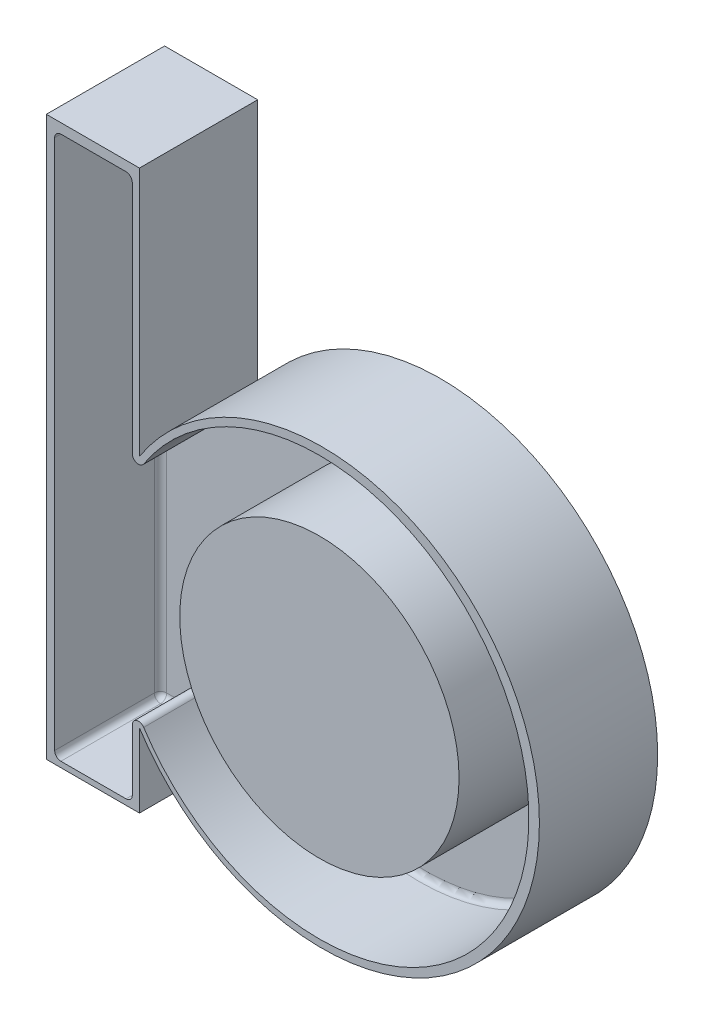
ISO-10303-21;
HEADER;
FILE_DESCRIPTION(('STEP AP214'),'2;1');
FILE_NAME('part.step','',(''),(''),'','','');
FILE_SCHEMA(('AUTOMOTIVE_DESIGN { 1 0 10303 214 1 1 1 1 }'));
ENDSEC;
DATA;
#1=APPLICATION_CONTEXT('core data for automotive mechanical design processes');
#2=APPLICATION_PROTOCOL_DEFINITION('international standard','automotive_design',2000,#1);
#3=PRODUCT_CONTEXT('',#1,'mechanical');
#4=PRODUCT('Part','Part','',(#3));
#5=PRODUCT_RELATED_PRODUCT_CATEGORY('part','',(#4));
#6=PRODUCT_DEFINITION_FORMATION('','',#4);
#7=PRODUCT_DEFINITION_CONTEXT('part definition',#1,'design');
#8=PRODUCT_DEFINITION('design','',#6,#7);
#9=PRODUCT_DEFINITION_SHAPE('','',#8);
#10=(LENGTH_UNIT() NAMED_UNIT(*) SI_UNIT(.MILLI.,.METRE.));
#11=(NAMED_UNIT(*) PLANE_ANGLE_UNIT() SI_UNIT($,.RADIAN.));
#12=(NAMED_UNIT(*) SI_UNIT($,.STERADIAN.) SOLID_ANGLE_UNIT());
#13=UNCERTAINTY_MEASURE_WITH_UNIT(LENGTH_MEASURE(1.E-05),#10,'distance_accuracy_value','');
#14=(GEOMETRIC_REPRESENTATION_CONTEXT(3) GLOBAL_UNCERTAINTY_ASSIGNED_CONTEXT((#13)) GLOBAL_UNIT_ASSIGNED_CONTEXT((#10,
#11,#12)) REPRESENTATION_CONTEXT('',''));
#15=CARTESIAN_POINT('',(0.,0.,0.));
#16=DIRECTION('',(0.,0.,1.));
#17=DIRECTION('',(1.,0.,0.));
#18=AXIS2_PLACEMENT_3D('',#15,#16,#17);
#19=CARTESIAN_POINT('',(29.6419050127039,18.0091974915424,19.05));
#20=DIRECTION('',(-1.,0.,0.));
#21=DIRECTION('',(0.,-1.,0.));
#22=AXIS2_PLACEMENT_3D('',#19,#20,#21);
#23=PLANE('',#22);
#24=DIRECTION('',(0.,1.,0.));
#25=VECTOR('',#24,1.);
#26=CARTESIAN_POINT('',(29.6419050127039,18.0091974915424,0.));
#27=LINE('',#26,#25);
#28=CARTESIAN_POINT('',(29.6419050127039,6.11678388725156,0.));
#29=VERTEX_POINT('',#28);
#30=CARTESIAN_POINT('',(29.6419050127036,18.0091974915423,0.));
#31=VERTEX_POINT('',#30);
#32=EDGE_CURVE('E212',#29,#31,#27,.T.);
#33=ORIENTED_EDGE('',*,*,#32,.T.);
#34=DIRECTION('',(0.,0.,-1.));
#35=VECTOR('',#34,1.);
#36=CARTESIAN_POINT('',(29.6419050127036,18.0091974915423,19.05));
#37=LINE('',#36,#35);
#38=CARTESIAN_POINT('',(29.6419050127036,18.0091974915423,19.05));
#39=VERTEX_POINT('',#38);
#40=EDGE_CURVE('E191',#39,#31,#37,.T.);
#41=ORIENTED_EDGE('',*,*,#40,.F.);
#42=DIRECTION('',(0.,1.,0.));
#43=VECTOR('',#42,1.);
#44=CARTESIAN_POINT('',(29.6419050127039,18.0091974915424,19.05));
#45=LINE('',#44,#43);
#46=CARTESIAN_POINT('',(29.6419050127039,6.11678388725156,19.05));
#47=VERTEX_POINT('',#46);
#48=EDGE_CURVE('E199',#47,#39,#45,.T.);
#49=ORIENTED_EDGE('',*,*,#48,.F.);
#50=DIRECTION('',(0.,0.,-1.));
#51=VECTOR('',#50,1.);
#52=CARTESIAN_POINT('',(29.6419050127039,6.11678388725156,19.05));
#53=LINE('',#52,#51);
#54=EDGE_CURVE('E412',#47,#29,#53,.T.);
#55=ORIENTED_EDGE('',*,*,#54,.T.);
#56=EDGE_LOOP('',(#33,#41,#49,#55));
#57=FACE_BOUND('',#56,.T.);
#58=ADVANCED_FACE('F43',(#57),#23,.F.);
#59=CARTESIAN_POINT('',(59.0779546085231,36.9437950365785,19.05));
#60=DIRECTION('',(0.,0.,-1.));
#61=DIRECTION('',(-1.,0.,0.));
#62=AXIS2_PLACEMENT_3D('',#59,#60,#61);
#63=CYLINDRICAL_SURFACE('',#62,35.0000000000006);
#64=CARTESIAN_POINT('',(59.0779546085231,36.9437950365785,0.));
#65=DIRECTION('',(0.,0.,1.));
#66=DIRECTION('',(1.,0.,0.));
#67=AXIS2_PLACEMENT_3D('',#64,#65,#66);
#68=CIRCLE('',#67,35.0000000000006);
#69=CARTESIAN_POINT('',(29.6419050127039,55.8783925816158,0.));
#70=VERTEX_POINT('',#69);
#71=EDGE_CURVE('E415',#31,#70,#68,.T.);
#72=ORIENTED_EDGE('',*,*,#71,.T.);
#73=DIRECTION('',(0.,0.,-1.));
#74=VECTOR('',#73,1.);
#75=CARTESIAN_POINT('',(29.6419050127039,55.8783925816158,19.05));
#76=LINE('',#75,#74);
#77=CARTESIAN_POINT('',(29.6419050127039,55.8783925816158,19.05));
#78=VERTEX_POINT('',#77);
#79=EDGE_CURVE('E194',#78,#70,#76,.T.);
#80=ORIENTED_EDGE('',*,*,#79,.F.);
#81=CARTESIAN_POINT('',(59.0779546085231,36.9437950365785,19.05));
#82=DIRECTION('',(0.,0.,1.));
#83=DIRECTION('',(1.,0.,0.));
#84=AXIS2_PLACEMENT_3D('',#81,#82,#83);
#85=CIRCLE('',#84,35.0000000000006);
#86=EDGE_CURVE('E187',#39,#78,#85,.T.);
#87=ORIENTED_EDGE('',*,*,#86,.F.);
#88=ORIENTED_EDGE('',*,*,#40,.T.);
#89=EDGE_LOOP('',(#72,#80,#87,#88));
#90=FACE_BOUND('',#89,.T.);
#91=ADVANCED_FACE('F189',(#90),#63,.T.);
#92=CARTESIAN_POINT('',(29.6419050127039,96.1167838872516,19.05));
#93=DIRECTION('',(-1.,0.,0.));
#94=DIRECTION('',(0.,-1.,0.));
#95=AXIS2_PLACEMENT_3D('',#92,#93,#94);
#96=PLANE('',#95);
#97=DIRECTION('',(0.,1.,0.));
#98=VECTOR('',#97,1.);
#99=CARTESIAN_POINT('',(29.6419050127039,96.1167838872516,0.));
#100=LINE('',#99,#98);
#101=CARTESIAN_POINT('',(29.6419050127039,96.1167838872516,0.));
#102=VERTEX_POINT('',#101);
#103=EDGE_CURVE('E418',#70,#102,#100,.T.);
#104=ORIENTED_EDGE('',*,*,#103,.T.);
#105=DIRECTION('',(0.,0.,-1.));
#106=VECTOR('',#105,1.);
#107=CARTESIAN_POINT('',(29.6419050127039,96.1167838872516,19.05));
#108=LINE('',#107,#106);
#109=CARTESIAN_POINT('',(29.6419050127039,96.1167838872516,19.05));
#110=VERTEX_POINT('',#109);
#111=EDGE_CURVE('E220',#110,#102,#108,.T.);
#112=ORIENTED_EDGE('',*,*,#111,.F.);
#113=DIRECTION('',(0.,1.,0.));
#114=VECTOR('',#113,1.);
#115=CARTESIAN_POINT('',(29.6419050127039,96.1167838872516,19.05));
#116=LINE('',#115,#114);
#117=EDGE_CURVE('E198',#78,#110,#116,.T.);
#118=ORIENTED_EDGE('',*,*,#117,.F.);
#119=ORIENTED_EDGE('',*,*,#79,.T.);
#120=EDGE_LOOP('',(#104,#112,#118,#119));
#121=FACE_BOUND('',#120,.T.);
#122=ADVANCED_FACE('F458',(#121),#96,.F.);
#123=CARTESIAN_POINT('',(14.6419050127039,96.1167838872516,19.05));
#124=DIRECTION('',(0.,-1.,0.));
#125=DIRECTION('',(0.,0.,-1.));
#126=AXIS2_PLACEMENT_3D('',#123,#124,#125);
#127=PLANE('',#126);
#128=DIRECTION('',(-1.,0.,0.));
#129=VECTOR('',#128,1.);
#130=CARTESIAN_POINT('',(14.6419050127039,96.1167838872516,0.));
#131=LINE('',#130,#129);
#132=CARTESIAN_POINT('',(14.6419050127039,96.1167838872516,0.));
#133=VERTEX_POINT('',#132);
#134=EDGE_CURVE('E421',#102,#133,#131,.T.);
#135=ORIENTED_EDGE('',*,*,#134,.T.);
#136=DIRECTION('',(0.,0.,-1.));
#137=VECTOR('',#136,1.);
#138=CARTESIAN_POINT('',(14.6419050127039,96.1167838872516,19.05));
#139=LINE('',#138,#137);
#140=CARTESIAN_POINT('',(14.6419050127039,96.1167838872516,19.05));
#141=VERTEX_POINT('',#140);
#142=EDGE_CURVE('E435',#141,#133,#139,.T.);
#143=ORIENTED_EDGE('',*,*,#142,.F.);
#144=DIRECTION('',(-1.,0.,0.));
#145=VECTOR('',#144,1.);
#146=CARTESIAN_POINT('',(14.6419050127039,96.1167838872516,19.05));
#147=LINE('',#146,#145);
#148=EDGE_CURVE('E404',#110,#141,#147,.T.);
#149=ORIENTED_EDGE('',*,*,#148,.F.);
#150=ORIENTED_EDGE('',*,*,#111,.T.);
#151=EDGE_LOOP('',(#135,#143,#149,#150));
#152=FACE_BOUND('',#151,.T.);
#153=ADVANCED_FACE('F444',(#152),#127,.F.);
#154=CARTESIAN_POINT('',(14.6419050127039,96.1167838872516,19.05));
#155=DIRECTION('',(1.,0.,0.));
#156=DIRECTION('',(0.,0.,-1.));
#157=AXIS2_PLACEMENT_3D('',#154,#155,#156);
#158=PLANE('',#157);
#159=DIRECTION('',(0.,-1.,0.));
#160=VECTOR('',#159,1.);
#161=CARTESIAN_POINT('',(14.6419050127039,96.1167838872516,0.));
#162=LINE('',#161,#160);
#163=CARTESIAN_POINT('',(14.6419050127039,6.11678388725156,0.));
#164=VERTEX_POINT('',#163);
#165=EDGE_CURVE('E424',#133,#164,#162,.T.);
#166=ORIENTED_EDGE('',*,*,#165,.T.);
#167=DIRECTION('',(0.,0.,-1.));
#168=VECTOR('',#167,1.);
#169=CARTESIAN_POINT('',(14.6419050127039,6.11678388725156,19.05));
#170=LINE('',#169,#168);
#171=CARTESIAN_POINT('',(14.6419050127039,6.11678388725156,19.05));
#172=VERTEX_POINT('',#171);
#173=EDGE_CURVE('E431',#172,#164,#170,.T.);
#174=ORIENTED_EDGE('',*,*,#173,.F.);
#175=DIRECTION('',(0.,-1.,0.));
#176=VECTOR('',#175,1.);
#177=CARTESIAN_POINT('',(14.6419050127039,96.1167838872516,19.05));
#178=LINE('',#177,#176);
#179=EDGE_CURVE('E407',#141,#172,#178,.T.);
#180=ORIENTED_EDGE('',*,*,#179,.F.);
#181=ORIENTED_EDGE('',*,*,#142,.T.);
#182=EDGE_LOOP('',(#166,#174,#180,#181));
#183=FACE_BOUND('',#182,.T.);
#184=ADVANCED_FACE('F454',(#183),#158,.F.);
#185=CARTESIAN_POINT('',(14.6419050127039,6.11678388725156,19.05));
#186=DIRECTION('',(0.,1.,0.));
#187=DIRECTION('',(0.,0.,1.));
#188=AXIS2_PLACEMENT_3D('',#185,#186,#187);
#189=PLANE('',#188);
#190=DIRECTION('',(1.,0.,0.));
#191=VECTOR('',#190,1.);
#192=CARTESIAN_POINT('',(14.6419050127039,6.11678388725156,0.));
#193=LINE('',#192,#191);
#194=EDGE_CURVE('E209',#164,#29,#193,.T.);
#195=ORIENTED_EDGE('',*,*,#194,.T.);
#196=ORIENTED_EDGE('',*,*,#54,.F.);
#197=DIRECTION('',(1.,0.,0.));
#198=VECTOR('',#197,1.);
#199=CARTESIAN_POINT('',(14.6419050127039,6.11678388725156,19.05));
#200=LINE('',#199,#198);
#201=EDGE_CURVE('E204',#172,#47,#200,.T.);
#202=ORIENTED_EDGE('',*,*,#201,.F.);
#203=ORIENTED_EDGE('',*,*,#173,.T.);
#204=EDGE_LOOP('',(#195,#196,#202,#203));
#205=FACE_BOUND('',#204,.T.);
#206=ADVANCED_FACE('F457',(#205),#189,.F.);
#207=CARTESIAN_POINT('',(59.0779546085231,36.9437950365785,19.05));
#208=DIRECTION('',(0.,0.,1.));
#209=DIRECTION('',(1.,0.,0.));
#210=AXIS2_PLACEMENT_3D('',#207,#208,#209);
#211=PLANE('',#210);
#212=CARTESIAN_POINT('',(58.6339937658264,36.7909244992604,19.05));
#213=DIRECTION('',(0.,0.,1.));
#214=DIRECTION('',(1.,0.,0.));
#215=AXIS2_PLACEMENT_3D('',#212,#213,#214);
#216=CIRCLE('',#215,33.75);
#217=CARTESIAN_POINT('',(30.3251131955791,18.4151311596663,19.05));
#218=VERTEX_POINT('',#217);
#219=CARTESIAN_POINT('',(30.3251131955791,55.1667178388545,19.05));
#220=VERTEX_POINT('',#219);
#221=EDGE_CURVE('E387',#218,#220,#216,.T.);
#222=ORIENTED_EDGE('',*,*,#221,.F.);
#223=CARTESIAN_POINT('',(29.4863315490532,17.8706632088635,19.05));
#224=DIRECTION('',(0.,0.,1.));
#225=DIRECTION('',(1.,0.,0.));
#226=AXIS2_PLACEMENT_3D('',#223,#224,#225);
#227=CIRCLE('',#226,1.);
#228=CARTESIAN_POINT('',(28.4863315490532,17.8706632088635,19.05));
#229=VERTEX_POINT('',#228);
#230=EDGE_CURVE('E233',#218,#229,#227,.T.);
#231=ORIENTED_EDGE('',*,*,#230,.T.);
#232=DIRECTION('',(0.,1.,0.));
#233=VECTOR('',#232,1.);
#234=CARTESIAN_POINT('',(28.4863315490532,21.619208615309,19.05));
#235=LINE('',#234,#233);
#236=CARTESIAN_POINT('',(28.4863315490532,8.02332142840254,19.05));
#237=VERTEX_POINT('',#236);
#238=EDGE_CURVE('E383',#237,#229,#235,.T.);
#239=ORIENTED_EDGE('',*,*,#238,.F.);
#240=CARTESIAN_POINT('',(27.4863315490532,8.02332142840254,19.05));
#241=DIRECTION('',(0.,0.,1.));
#242=DIRECTION('',(1.,0.,0.));
#243=AXIS2_PLACEMENT_3D('',#240,#241,#242);
#244=CIRCLE('',#243,1.);
#245=CARTESIAN_POINT('',(27.4863315490532,7.02332142840253,19.05));
#246=VERTEX_POINT('',#245);
#247=EDGE_CURVE('E297',#237,#246,#244,.F.);
#248=ORIENTED_EDGE('',*,*,#247,.T.);
#249=DIRECTION('',(1.,0.,0.));
#250=VECTOR('',#249,1.);
#251=CARTESIAN_POINT('',(15.9863315490532,7.02332142840253,19.05));
#252=LINE('',#251,#250);
#253=CARTESIAN_POINT('',(16.9863315490532,7.02332142840253,19.05));
#254=VERTEX_POINT('',#253);
#255=EDGE_CURVE('E373',#254,#246,#252,.T.);
#256=ORIENTED_EDGE('',*,*,#255,.F.);
#257=CARTESIAN_POINT('',(16.9863315490532,8.02332142840254,19.05));
#258=DIRECTION('',(0.,0.,1.));
#259=DIRECTION('',(1.,0.,0.));
#260=AXIS2_PLACEMENT_3D('',#257,#258,#259);
#261=CIRCLE('',#260,1.);
#262=CARTESIAN_POINT('',(15.9863315490532,8.02332142840254,19.05));
#263=VERTEX_POINT('',#262);
#264=EDGE_CURVE('E300',#254,#263,#261,.F.);
#265=ORIENTED_EDGE('',*,*,#264,.T.);
#266=DIRECTION('',(0.,-1.,0.));
#267=VECTOR('',#266,1.);
#268=CARTESIAN_POINT('',(15.9863315490532,94.5233214284025,19.05));
#269=LINE('',#268,#267);
#270=CARTESIAN_POINT('',(15.9863315490532,93.5233214284025,19.05));
#271=VERTEX_POINT('',#270);
#272=EDGE_CURVE('E380',#271,#263,#269,.T.);
#273=ORIENTED_EDGE('',*,*,#272,.F.);
#274=CARTESIAN_POINT('',(16.9863315490532,93.5233214284025,19.05));
#275=DIRECTION('',(0.,0.,1.));
#276=DIRECTION('',(1.,0.,0.));
#277=AXIS2_PLACEMENT_3D('',#274,#275,#276);
#278=CIRCLE('',#277,1.);
#279=CARTESIAN_POINT('',(16.9863315490532,94.5233214284025,19.05));
#280=VERTEX_POINT('',#279);
#281=EDGE_CURVE('E53',#271,#280,#278,.F.);
#282=ORIENTED_EDGE('',*,*,#281,.T.);
#283=DIRECTION('',(-1.,0.,0.));
#284=VECTOR('',#283,1.);
#285=CARTESIAN_POINT('',(15.9863315490532,94.5233214284025,19.05));
#286=LINE('',#285,#284);
#287=CARTESIAN_POINT('',(27.4863315490532,94.5233214284025,19.05));
#288=VERTEX_POINT('',#287);
#289=EDGE_CURVE('E395',#288,#280,#286,.T.);
#290=ORIENTED_EDGE('',*,*,#289,.F.);
#291=CARTESIAN_POINT('',(27.4863315490532,93.5233214284025,19.05));
#292=DIRECTION('',(0.,0.,1.));
#293=DIRECTION('',(1.,0.,0.));
#294=AXIS2_PLACEMENT_3D('',#291,#292,#293);
#295=CIRCLE('',#294,1.);
#296=CARTESIAN_POINT('',(28.4863315490532,93.5233214284025,19.05));
#297=VERTEX_POINT('',#296);
#298=EDGE_CURVE('E11',#288,#297,#295,.F.);
#299=ORIENTED_EDGE('',*,*,#298,.T.);
#300=DIRECTION('',(0.,1.,0.));
#301=VECTOR('',#300,1.);
#302=CARTESIAN_POINT('',(28.4863315490532,94.5233214284025,19.05));
#303=LINE('',#302,#301);
#304=CARTESIAN_POINT('',(28.4863315490532,55.7111857896573,19.05));
#305=VERTEX_POINT('',#304);
#306=EDGE_CURVE('E391',#305,#297,#303,.T.);
#307=ORIENTED_EDGE('',*,*,#306,.F.);
#308=CARTESIAN_POINT('',(29.4863315490532,55.7111857896573,19.05));
#309=DIRECTION('',(0.,0.,1.));
#310=DIRECTION('',(1.,0.,0.));
#311=AXIS2_PLACEMENT_3D('',#308,#309,#310);
#312=CIRCLE('',#311,1.);
#313=EDGE_CURVE('E230',#305,#220,#312,.T.);
#314=ORIENTED_EDGE('',*,*,#313,.T.);
#315=EDGE_LOOP('',(#222,#231,#239,#248,#256,#265,#273,#282,#290,#299,#307,#314));
#316=FACE_BOUND('',#315,.T.);
#317=ORIENTED_EDGE('',*,*,#48,.T.);
#318=ORIENTED_EDGE('',*,*,#86,.T.);
#319=ORIENTED_EDGE('',*,*,#117,.T.);
#320=ORIENTED_EDGE('',*,*,#148,.T.);
#321=ORIENTED_EDGE('',*,*,#179,.T.);
#322=ORIENTED_EDGE('',*,*,#201,.T.);
#323=EDGE_LOOP('',(#317,#318,#319,#320,#321,#322));
#324=FACE_BOUND('',#323,.T.);
#325=ADVANCED_FACE('F202',(#316,#324),#211,.T.);
#326=CARTESIAN_POINT('',(59.0779546085231,36.9437950365785,0.));
#327=DIRECTION('',(0.,0.,1.));
#328=DIRECTION('',(1.,0.,0.));
#329=AXIS2_PLACEMENT_3D('',#326,#327,#328);
#330=PLANE('',#329);
#331=ORIENTED_EDGE('',*,*,#32,.F.);
#332=ORIENTED_EDGE('',*,*,#194,.F.);
#333=ORIENTED_EDGE('',*,*,#165,.F.);
#334=ORIENTED_EDGE('',*,*,#134,.F.);
#335=ORIENTED_EDGE('',*,*,#103,.F.);
#336=ORIENTED_EDGE('',*,*,#71,.F.);
#337=EDGE_LOOP('',(#331,#332,#333,#334,#335,#336));
#338=FACE_BOUND('',#337,.T.);
#339=ADVANCED_FACE('F450',(#338),#330,.F.);
#340=CARTESIAN_POINT('',(15.9863315490532,7.02332142840253,2.));
#341=DIRECTION('',(0.,-1.,0.));
#342=DIRECTION('',(0.,0.,-1.));
#343=AXIS2_PLACEMENT_3D('',#340,#341,#342);
#344=PLANE('',#343);
#345=ORIENTED_EDGE('',*,*,#255,.T.);
#346=DIRECTION('',(0.,0.,1.));
#347=VECTOR('',#346,1.);
#348=CARTESIAN_POINT('',(27.4863315490532,7.02332142840253,2.));
#349=LINE('',#348,#347);
#350=CARTESIAN_POINT('',(27.4863315490532,7.02332142840253,3.));
#351=VERTEX_POINT('',#350);
#352=EDGE_CURVE('E61',#246,#351,#349,.F.);
#353=ORIENTED_EDGE('',*,*,#352,.T.);
#354=DIRECTION('',(1.,0.,0.));
#355=VECTOR('',#354,1.);
#356=CARTESIAN_POINT('',(15.9863315490532,7.02332142840253,3.));
#357=LINE('',#356,#355);
#358=CARTESIAN_POINT('',(16.9863315490532,7.02332142840253,3.));
#359=VERTEX_POINT('',#358);
#360=EDGE_CURVE('E65',#351,#359,#357,.F.);
#361=ORIENTED_EDGE('',*,*,#360,.T.);
#362=DIRECTION('',(0.,0.,1.));
#363=VECTOR('',#362,1.);
#364=CARTESIAN_POINT('',(16.9863315490532,7.02332142840253,19.05));
#365=LINE('',#364,#363);
#366=EDGE_CURVE('E278',#359,#254,#365,.T.);
#367=ORIENTED_EDGE('',*,*,#366,.T.);
#368=EDGE_LOOP('',(#345,#353,#361,#367));
#369=FACE_BOUND('',#368,.T.);
#370=ADVANCED_FACE('F599',(#369),#344,.F.);
#371=CARTESIAN_POINT('',(15.9863315490532,94.5233214284025,2.));
#372=DIRECTION('',(-1.,0.,0.));
#373=DIRECTION('',(0.,-1.,0.));
#374=AXIS2_PLACEMENT_3D('',#371,#372,#373);
#375=PLANE('',#374);
#376=ORIENTED_EDGE('',*,*,#272,.T.);
#377=DIRECTION('',(0.,0.,1.));
#378=VECTOR('',#377,1.);
#379=CARTESIAN_POINT('',(15.9863315490532,8.02332142840254,2.));
#380=LINE('',#379,#378);
#381=CARTESIAN_POINT('',(15.9863315490532,8.02332142840254,3.));
#382=VERTEX_POINT('',#381);
#383=EDGE_CURVE('E275',#263,#382,#380,.F.);
#384=ORIENTED_EDGE('',*,*,#383,.T.);
#385=DIRECTION('',(0.,-1.,0.));
#386=VECTOR('',#385,1.);
#387=CARTESIAN_POINT('',(15.9863315490532,94.5233214284025,3.));
#388=LINE('',#387,#386);
#389=CARTESIAN_POINT('',(15.9863315490532,93.5233214284025,3.));
#390=VERTEX_POINT('',#389);
#391=EDGE_CURVE('E272',#382,#390,#388,.F.);
#392=ORIENTED_EDGE('',*,*,#391,.T.);
#393=DIRECTION('',(0.,0.,1.));
#394=VECTOR('',#393,1.);
#395=CARTESIAN_POINT('',(15.9863315490532,93.5233214284025,19.05));
#396=LINE('',#395,#394);
#397=EDGE_CURVE('E269',#390,#271,#396,.T.);
#398=ORIENTED_EDGE('',*,*,#397,.T.);
#399=EDGE_LOOP('',(#376,#384,#392,#398));
#400=FACE_BOUND('',#399,.T.);
#401=ADVANCED_FACE('F537',(#400),#375,.F.);
#402=CARTESIAN_POINT('',(15.9863315490532,94.5233214284025,2.));
#403=DIRECTION('',(0.,1.,0.));
#404=DIRECTION('',(0.,0.,1.));
#405=AXIS2_PLACEMENT_3D('',#402,#403,#404);
#406=PLANE('',#405);
#407=ORIENTED_EDGE('',*,*,#289,.T.);
#408=DIRECTION('',(0.,0.,1.));
#409=VECTOR('',#408,1.);
#410=CARTESIAN_POINT('',(16.9863315490532,94.5233214284025,2.));
#411=LINE('',#410,#409);
#412=CARTESIAN_POINT('',(16.9863315490532,94.5233214284025,2.));
#413=VERTEX_POINT('',#412);
#414=EDGE_CURVE('E288',#280,#413,#411,.F.);
#415=ORIENTED_EDGE('',*,*,#414,.T.);
#416=DIRECTION('',(-1.,0.,0.));
#417=VECTOR('',#416,1.);
#418=CARTESIAN_POINT('',(15.9863315490532,94.5233214284025,2.));
#419=LINE('',#418,#417);
#420=CARTESIAN_POINT('',(27.4863315490532,94.5233214284025,2.));
#421=VERTEX_POINT('',#420);
#422=EDGE_CURVE('E376',#421,#413,#419,.T.);
#423=ORIENTED_EDGE('',*,*,#422,.F.);
#424=DIRECTION('',(0.,0.,1.));
#425=VECTOR('',#424,1.);
#426=CARTESIAN_POINT('',(27.4863315490532,94.5233214284025,19.05));
#427=LINE('',#426,#425);
#428=EDGE_CURVE('E285',#421,#288,#427,.T.);
#429=ORIENTED_EDGE('',*,*,#428,.T.);
#430=EDGE_LOOP('',(#407,#415,#423,#429));
#431=FACE_BOUND('',#430,.T.);
#432=ADVANCED_FACE('F543',(#431),#406,.F.);
#433=CARTESIAN_POINT('',(28.4863315490532,94.5233214284025,2.));
#434=DIRECTION('',(1.,0.,0.));
#435=DIRECTION('',(0.,1.,0.));
#436=AXIS2_PLACEMENT_3D('',#433,#434,#435);
#437=PLANE('',#436);
#438=DIRECTION('',(0.,1.,0.));
#439=VECTOR('',#438,1.);
#440=CARTESIAN_POINT('',(28.4863315490532,94.5233214284025,3.));
#441=LINE('',#440,#439);
#442=CARTESIAN_POINT('',(28.4863315490532,93.5233214284025,3.));
#443=VERTEX_POINT('',#442);
#444=CARTESIAN_POINT('',(28.4863315490532,55.7111857896573,3.));
#445=VERTEX_POINT('',#444);
#446=EDGE_CURVE('E248',#443,#445,#441,.F.);
#447=ORIENTED_EDGE('',*,*,#446,.T.);
#448=DIRECTION('',(0.,0.,1.));
#449=VECTOR('',#448,1.);
#450=CARTESIAN_POINT('',(28.4863315490532,55.7111857896573,2.));
#451=LINE('',#450,#449);
#452=EDGE_CURVE('E251',#445,#305,#451,.T.);
#453=ORIENTED_EDGE('',*,*,#452,.T.);
#454=ORIENTED_EDGE('',*,*,#306,.T.);
#455=DIRECTION('',(0.,0.,1.));
#456=VECTOR('',#455,1.);
#457=CARTESIAN_POINT('',(28.4863315490532,93.5233214284025,2.));
#458=LINE('',#457,#456);
#459=EDGE_CURVE('E245',#297,#443,#458,.F.);
#460=ORIENTED_EDGE('',*,*,#459,.T.);
#461=EDGE_LOOP('',(#447,#453,#454,#460));
#462=FACE_BOUND('',#461,.T.);
#463=ADVANCED_FACE('F553',(#462),#437,.F.);
#464=CARTESIAN_POINT('',(58.6339937658264,36.7909244992604,2.));
#465=DIRECTION('',(0.,0.,1.));
#466=DIRECTION('',(1.,0.,0.));
#467=AXIS2_PLACEMENT_3D('',#464,#465,#466);
#468=CYLINDRICAL_SURFACE('',#467,33.75);
#469=CARTESIAN_POINT('',(58.6339937658264,36.7909244992604,3.));
#470=DIRECTION('',(0.,0.,1.));
#471=DIRECTION('',(1.,0.,0.));
#472=AXIS2_PLACEMENT_3D('',#469,#470,#471);
#473=CIRCLE('',#472,33.75);
#474=CARTESIAN_POINT('',(30.3251131955791,55.1667178388545,3.));
#475=VERTEX_POINT('',#474);
#476=CARTESIAN_POINT('',(30.3251131955791,18.4151311596663,3.));
#477=VERTEX_POINT('',#476);
#478=EDGE_CURVE('E214',#475,#477,#473,.F.);
#479=ORIENTED_EDGE('',*,*,#478,.T.);
#480=DIRECTION('',(0.,0.,1.));
#481=VECTOR('',#480,1.);
#482=CARTESIAN_POINT('',(30.3251131955791,18.4151311596663,2.));
#483=LINE('',#482,#481);
#484=EDGE_CURVE('E226',#477,#218,#483,.T.);
#485=ORIENTED_EDGE('',*,*,#484,.T.);
#486=ORIENTED_EDGE('',*,*,#221,.T.);
#487=DIRECTION('',(0.,0.,1.));
#488=VECTOR('',#487,1.);
#489=CARTESIAN_POINT('',(30.3251131955791,55.1667178388545,2.));
#490=LINE('',#489,#488);
#491=EDGE_CURVE('E218',#220,#475,#490,.F.);
#492=ORIENTED_EDGE('',*,*,#491,.T.);
#493=EDGE_LOOP('',(#479,#485,#486,#492));
#494=FACE_BOUND('',#493,.T.);
#495=ADVANCED_FACE('F560',(#494),#468,.F.);
#496=CARTESIAN_POINT('',(28.4863315490532,21.619208615309,2.));
#497=DIRECTION('',(1.,0.,0.));
#498=DIRECTION('',(0.,0.,-1.));
#499=AXIS2_PLACEMENT_3D('',#496,#497,#498);
#500=PLANE('',#499);
#501=ORIENTED_EDGE('',*,*,#238,.T.);
#502=DIRECTION('',(0.,0.,1.));
#503=VECTOR('',#502,1.);
#504=CARTESIAN_POINT('',(28.4863315490532,17.8706632088635,2.));
#505=LINE('',#504,#503);
#506=CARTESIAN_POINT('',(28.4863315490532,17.8706632088635,3.));
#507=VERTEX_POINT('',#506);
#508=EDGE_CURVE('E242',#229,#507,#505,.F.);
#509=ORIENTED_EDGE('',*,*,#508,.T.);
#510=DIRECTION('',(0.,1.,0.));
#511=VECTOR('',#510,1.);
#512=CARTESIAN_POINT('',(28.4863315490532,21.619208615309,3.));
#513=LINE('',#512,#511);
#514=CARTESIAN_POINT('',(28.4863315490532,8.02332142840254,3.));
#515=VERTEX_POINT('',#514);
#516=EDGE_CURVE('E239',#507,#515,#513,.F.);
#517=ORIENTED_EDGE('',*,*,#516,.T.);
#518=DIRECTION('',(0.,0.,1.));
#519=VECTOR('',#518,1.);
#520=CARTESIAN_POINT('',(28.4863315490532,8.02332142840254,19.05));
#521=LINE('',#520,#519);
#522=EDGE_CURVE('E236',#515,#237,#521,.T.);
#523=ORIENTED_EDGE('',*,*,#522,.T.);
#524=EDGE_LOOP('',(#501,#509,#517,#523));
#525=FACE_BOUND('',#524,.T.);
#526=ADVANCED_FACE('F569',(#525),#500,.F.);
#527=CARTESIAN_POINT('',(58.6339937658264,36.7909244992604,2.));
#528=DIRECTION('',(0.,0.,1.));
#529=DIRECTION('',(1.,0.,0.));
#530=AXIS2_PLACEMENT_3D('',#527,#528,#529);
#531=PLANE('',#530);
#532=CARTESIAN_POINT('',(58.6339937658264,36.7909244992604,2.));
#533=DIRECTION('',(0.,0.,1.));
#534=DIRECTION('',(1.,0.,0.));
#535=AXIS2_PLACEMENT_3D('',#532,#533,#534);
#536=CIRCLE('',#535,22.5);
#537=CARTESIAN_POINT('',(81.1339937658264,36.7909244992604,2.));
#538=VERTEX_POINT('',#537);
#539=EDGE_CURVE('E367',#538,#538,#536,.T.);
#540=ORIENTED_EDGE('',*,*,#539,.F.);
#541=EDGE_LOOP('',(#540));
#542=FACE_BOUND('',#541,.T.);
#543=CARTESIAN_POINT('',(58.6339937658264,36.7909244992604,2.));
#544=DIRECTION('',(0.,0.,1.));
#545=DIRECTION('',(1.,0.,0.));
#546=AXIS2_PLACEMENT_3D('',#543,#544,#545);
#547=CIRCLE('',#546,32.75);
#548=CARTESIAN_POINT('',(31.1638948421049,18.9595991104691,2.));
#549=VERTEX_POINT('',#548);
#550=CARTESIAN_POINT('',(31.1638948421049,54.6222498880517,2.));
#551=VERTEX_POINT('',#550);
#552=EDGE_CURVE('E266',#549,#551,#547,.T.);
#553=ORIENTED_EDGE('',*,*,#552,.T.);
#554=CARTESIAN_POINT('',(29.4863315490532,55.7111857896573,2.));
#555=DIRECTION('',(0.,0.,1.));
#556=DIRECTION('',(1.,0.,0.));
#557=AXIS2_PLACEMENT_3D('',#554,#555,#556);
#558=CIRCLE('',#557,2.);
#559=CARTESIAN_POINT('',(27.4863315490532,55.7111857896573,2.));
#560=VERTEX_POINT('',#559);
#561=EDGE_CURVE('E294',#551,#560,#558,.F.);
#562=ORIENTED_EDGE('',*,*,#561,.T.);
#563=DIRECTION('',(0.,1.,0.));
#564=VECTOR('',#563,1.);
#565=CARTESIAN_POINT('',(27.4863315490532,36.7909244992604,2.));
#566=LINE('',#565,#564);
#567=EDGE_CURVE('E263',#560,#421,#566,.T.);
#568=ORIENTED_EDGE('',*,*,#567,.T.);
#569=ORIENTED_EDGE('',*,*,#422,.T.);
#570=DIRECTION('',(0.,-1.,0.));
#571=VECTOR('',#570,1.);
#572=CARTESIAN_POINT('',(16.9863315490532,36.7909244992604,2.));
#573=LINE('',#572,#571);
#574=CARTESIAN_POINT('',(16.9863315490532,8.02332142840254,2.));
#575=VERTEX_POINT('',#574);
#576=EDGE_CURVE('E257',#413,#575,#573,.T.);
#577=ORIENTED_EDGE('',*,*,#576,.T.);
#578=DIRECTION('',(1.,0.,0.));
#579=VECTOR('',#578,1.);
#580=CARTESIAN_POINT('',(58.6339937658264,8.02332142840254,2.));
#581=LINE('',#580,#579);
#582=CARTESIAN_POINT('',(27.4863315490532,8.02332142840254,2.));
#583=VERTEX_POINT('',#582);
#584=EDGE_CURVE('E254',#575,#583,#581,.T.);
#585=ORIENTED_EDGE('',*,*,#584,.T.);
#586=DIRECTION('',(0.,1.,0.));
#587=VECTOR('',#586,1.);
#588=CARTESIAN_POINT('',(27.4863315490532,36.7909244992604,2.));
#589=LINE('',#588,#587);
#590=CARTESIAN_POINT('',(27.4863315490532,17.8706632088635,2.));
#591=VERTEX_POINT('',#590);
#592=EDGE_CURVE('E260',#583,#591,#589,.T.);
#593=ORIENTED_EDGE('',*,*,#592,.T.);
#594=CARTESIAN_POINT('',(29.4863315490532,17.8706632088635,2.));
#595=DIRECTION('',(0.,0.,1.));
#596=DIRECTION('',(1.,0.,0.));
#597=AXIS2_PLACEMENT_3D('',#594,#595,#596);
#598=CIRCLE('',#597,2.);
#599=EDGE_CURVE('E291',#591,#549,#598,.F.);
#600=ORIENTED_EDGE('',*,*,#599,.T.);
#601=EDGE_LOOP('',(#553,#562,#568,#569,#577,#585,#593,#600));
#602=FACE_BOUND('',#601,.T.);
#603=ADVANCED_FACE('F579',(#542,#602),#531,.T.);
#604=CARTESIAN_POINT('',(58.6339937658264,36.7909244992604,2.));
#605=DIRECTION('',(0.,0.,1.));
#606=DIRECTION('',(1.,0.,0.));
#607=AXIS2_PLACEMENT_3D('',#604,#605,#606);
#608=CYLINDRICAL_SURFACE('',#607,22.5);
#609=ORIENTED_EDGE('',*,*,#539,.T.);
#610=EDGE_LOOP('',(#609));
#611=FACE_BOUND('',#610,.T.);
#612=CARTESIAN_POINT('',(58.6339937658264,36.7909244992604,19.05));
#613=DIRECTION('',(0.,0.,1.));
#614=DIRECTION('',(1.,0.,0.));
#615=AXIS2_PLACEMENT_3D('',#612,#613,#614);
#616=CIRCLE('',#615,22.5);
#617=CARTESIAN_POINT('',(81.1339937658264,36.7909244992604,19.05));
#618=VERTEX_POINT('',#617);
#619=EDGE_CURVE('E360',#618,#618,#616,.T.);
#620=ORIENTED_EDGE('',*,*,#619,.F.);
#621=EDGE_LOOP('',(#620));
#622=FACE_BOUND('',#621,.T.);
#623=ADVANCED_FACE('F585',(#611,#622),#608,.T.);
#624=ORIENTED_EDGE('',*,*,#619,.T.);
#625=EDGE_LOOP('',(#624));
#626=FACE_BOUND('',#625,.T.);
#627=ADVANCED_FACE('F527',(#626),#211,.T.);
#628=CARTESIAN_POINT('',(16.9863315490532,93.5233214284025,2.));
#629=DIRECTION('',(0.,0.,-1.));
#630=DIRECTION('',(-1.,0.,0.));
#631=AXIS2_PLACEMENT_3D('',#628,#629,#630);
#632=CYLINDRICAL_SURFACE('',#631,1.);
#633=ORIENTED_EDGE('',*,*,#281,.F.);
#634=ORIENTED_EDGE('',*,*,#397,.F.);
#635=CARTESIAN_POINT('',(16.9863315490532,93.5233214284025,3.));
#636=DIRECTION('',(0.,-0.707106781186547,-0.707106781186547));
#637=DIRECTION('',(0.,-0.707106781186547,0.707106781186547));
#638=AXIS2_PLACEMENT_3D('',#635,#636,#637);
#639=ELLIPSE('',#638,1.41421356237309,1.);
#640=EDGE_CURVE('E47',#413,#390,#639,.F.);
#641=ORIENTED_EDGE('',*,*,#640,.F.);
#642=ORIENTED_EDGE('',*,*,#414,.F.);
#643=EDGE_LOOP('',(#633,#634,#641,#642));
#644=FACE_BOUND('',#643,.T.);
#645=ADVANCED_FACE('F45',(#644),#632,.F.);
#646=CARTESIAN_POINT('',(16.9863315490532,8.02332142840254,2.));
#647=DIRECTION('',(0.,0.,-1.));
#648=DIRECTION('',(-1.,0.,0.));
#649=AXIS2_PLACEMENT_3D('',#646,#647,#648);
#650=CYLINDRICAL_SURFACE('',#649,1.);
#651=ORIENTED_EDGE('',*,*,#264,.F.);
#652=ORIENTED_EDGE('',*,*,#366,.F.);
#653=CARTESIAN_POINT('',(16.9863315490532,8.02332142840254,3.));
#654=DIRECTION('',(0.,0.,1.));
#655=DIRECTION('',(1.,0.,0.));
#656=AXIS2_PLACEMENT_3D('',#653,#654,#655);
#657=CIRCLE('',#656,1.);
#658=EDGE_CURVE('E352',#382,#359,#657,.T.);
#659=ORIENTED_EDGE('',*,*,#658,.F.);
#660=ORIENTED_EDGE('',*,*,#383,.F.);
#661=EDGE_LOOP('',(#651,#652,#659,#660));
#662=FACE_BOUND('',#661,.T.);
#663=ADVANCED_FACE('F521',(#662),#650,.F.);
#664=CARTESIAN_POINT('',(16.9863315490532,36.7909244992604,3.));
#665=DIRECTION('',(0.,-1.,0.));
#666=DIRECTION('',(1.,0.,0.));
#667=AXIS2_PLACEMENT_3D('',#664,#665,#666);
#668=CYLINDRICAL_SURFACE('',#667,1.);
#669=ORIENTED_EDGE('',*,*,#640,.T.);
#670=ORIENTED_EDGE('',*,*,#391,.F.);
#671=CARTESIAN_POINT('',(16.9863315490532,8.02332142840254,3.));
#672=DIRECTION('',(0.,1.,0.));
#673=DIRECTION('',(0.,0.,1.));
#674=AXIS2_PLACEMENT_3D('',#671,#672,#673);
#675=CIRCLE('',#674,1.);
#676=EDGE_CURVE('E349',#575,#382,#675,.T.);
#677=ORIENTED_EDGE('',*,*,#676,.F.);
#678=ORIENTED_EDGE('',*,*,#576,.F.);
#679=EDGE_LOOP('',(#669,#670,#677,#678));
#680=FACE_BOUND('',#679,.T.);
#681=ADVANCED_FACE('F519',(#680),#668,.F.);
#682=CARTESIAN_POINT('',(16.9863315490532,8.02332142840254,3.));
#683=DIRECTION('',(-1.,0.,0.));
#684=DIRECTION('',(0.,0.,1.));
#685=AXIS2_PLACEMENT_3D('',#682,#683,#684);
#686=SPHERICAL_SURFACE('',#685,1.);
#687=ORIENTED_EDGE('',*,*,#676,.T.);
#688=ORIENTED_EDGE('',*,*,#658,.T.);
#689=CARTESIAN_POINT('',(16.9863315490532,8.02332142840254,3.));
#690=DIRECTION('',(1.,0.,0.));
#691=DIRECTION('',(0.,0.,-1.));
#692=AXIS2_PLACEMENT_3D('',#689,#690,#691);
#693=CIRCLE('',#692,1.);
#694=EDGE_CURVE('E345',#575,#359,#693,.F.);
#695=ORIENTED_EDGE('',*,*,#694,.F.);
#696=EDGE_LOOP('',(#687,#688,#695));
#697=FACE_BOUND('',#696,.T.);
#698=ADVANCED_FACE('F515',(#697),#686,.F.);
#699=CARTESIAN_POINT('',(27.4863315490532,93.5233214284025,2.));
#700=DIRECTION('',(0.,0.,-1.));
#701=DIRECTION('',(-1.,0.,0.));
#702=AXIS2_PLACEMENT_3D('',#699,#700,#701);
#703=CYLINDRICAL_SURFACE('',#702,1.);
#704=ORIENTED_EDGE('',*,*,#298,.F.);
#705=ORIENTED_EDGE('',*,*,#428,.F.);
#706=CARTESIAN_POINT('',(27.4863315490532,93.5233214284025,3.));
#707=DIRECTION('',(0.,0.707106781186547,0.707106781186547));
#708=DIRECTION('',(0.,0.707106781186547,-0.707106781186547));
#709=AXIS2_PLACEMENT_3D('',#706,#707,#708);
#710=ELLIPSE('',#709,1.41421356237309,1.);
#711=EDGE_CURVE('E341',#443,#421,#710,.T.);
#712=ORIENTED_EDGE('',*,*,#711,.F.);
#713=ORIENTED_EDGE('',*,*,#459,.F.);
#714=EDGE_LOOP('',(#704,#705,#712,#713));
#715=FACE_BOUND('',#714,.T.);
#716=ADVANCED_FACE('F511',(#715),#703,.F.);
#717=CARTESIAN_POINT('',(27.4863315490532,8.02332142840254,2.));
#718=DIRECTION('',(0.,0.,-1.));
#719=DIRECTION('',(-1.,0.,0.));
#720=AXIS2_PLACEMENT_3D('',#717,#718,#719);
#721=CYLINDRICAL_SURFACE('',#720,1.);
#722=ORIENTED_EDGE('',*,*,#247,.F.);
#723=ORIENTED_EDGE('',*,*,#522,.F.);
#724=CARTESIAN_POINT('',(27.4863315490532,8.02332142840254,3.));
#725=DIRECTION('',(0.,0.,1.));
#726=DIRECTION('',(1.,0.,0.));
#727=AXIS2_PLACEMENT_3D('',#724,#725,#726);
#728=CIRCLE('',#727,1.);
#729=EDGE_CURVE('E337',#351,#515,#728,.T.);
#730=ORIENTED_EDGE('',*,*,#729,.F.);
#731=ORIENTED_EDGE('',*,*,#352,.F.);
#732=EDGE_LOOP('',(#722,#723,#730,#731));
#733=FACE_BOUND('',#732,.T.);
#734=ADVANCED_FACE('F507',(#733),#721,.F.);
#735=CARTESIAN_POINT('',(58.6339937658264,8.02332142840254,3.));
#736=DIRECTION('',(1.,0.,0.));
#737=DIRECTION('',(0.,0.,-1.));
#738=AXIS2_PLACEMENT_3D('',#735,#736,#737);
#739=CYLINDRICAL_SURFACE('',#738,1.);
#740=ORIENTED_EDGE('',*,*,#694,.T.);
#741=ORIENTED_EDGE('',*,*,#360,.F.);
#742=CARTESIAN_POINT('',(27.4863315490532,8.02332142840254,3.));
#743=DIRECTION('',(-1.,0.,0.));
#744=DIRECTION('',(0.,0.,1.));
#745=AXIS2_PLACEMENT_3D('',#742,#743,#744);
#746=CIRCLE('',#745,1.);
#747=EDGE_CURVE('E333',#583,#351,#746,.T.);
#748=ORIENTED_EDGE('',*,*,#747,.F.);
#749=ORIENTED_EDGE('',*,*,#584,.F.);
#750=EDGE_LOOP('',(#740,#741,#748,#749));
#751=FACE_BOUND('',#750,.T.);
#752=ADVANCED_FACE('F503',(#751),#739,.F.);
#753=CARTESIAN_POINT('',(27.4863315490532,36.7909244992604,3.));
#754=DIRECTION('',(0.,1.,0.));
#755=DIRECTION('',(-1.,0.,0.));
#756=AXIS2_PLACEMENT_3D('',#753,#754,#755);
#757=CYLINDRICAL_SURFACE('',#756,1.);
#758=ORIENTED_EDGE('',*,*,#711,.T.);
#759=ORIENTED_EDGE('',*,*,#567,.F.);
#760=CARTESIAN_POINT('',(27.4863315490532,55.7111857896573,3.));
#761=DIRECTION('',(0.,1.,0.));
#762=DIRECTION('',(0.,0.,1.));
#763=AXIS2_PLACEMENT_3D('',#760,#761,#762);
#764=CIRCLE('',#763,1.);
#765=EDGE_CURVE('E329',#445,#560,#764,.T.);
#766=ORIENTED_EDGE('',*,*,#765,.F.);
#767=ORIENTED_EDGE('',*,*,#446,.F.);
#768=EDGE_LOOP('',(#758,#759,#766,#767));
#769=FACE_BOUND('',#768,.T.);
#770=ADVANCED_FACE('F499',(#769),#757,.F.);
#771=CARTESIAN_POINT('',(29.4863315490532,55.7111857896573,2.));
#772=DIRECTION('',(0.,0.,1.));
#773=DIRECTION('',(1.,0.,0.));
#774=AXIS2_PLACEMENT_3D('',#771,#772,#773);
#775=CYLINDRICAL_SURFACE('',#774,1.);
#776=ORIENTED_EDGE('',*,*,#313,.F.);
#777=ORIENTED_EDGE('',*,*,#452,.F.);
#778=CARTESIAN_POINT('',(29.4863315490532,55.7111857896573,3.));
#779=DIRECTION('',(0.,0.,1.));
#780=DIRECTION('',(1.,0.,0.));
#781=AXIS2_PLACEMENT_3D('',#778,#779,#780);
#782=CIRCLE('',#781,1.);
#783=EDGE_CURVE('E325',#475,#445,#782,.F.);
#784=ORIENTED_EDGE('',*,*,#783,.F.);
#785=ORIENTED_EDGE('',*,*,#491,.F.);
#786=EDGE_LOOP('',(#776,#777,#784,#785));
#787=FACE_BOUND('',#786,.T.);
#788=ADVANCED_FACE('F495',(#787),#775,.T.);
#789=CARTESIAN_POINT('',(27.4863315490532,8.02332142840254,3.));
#790=DIRECTION('',(0.,-1.,0.));
#791=DIRECTION('',(0.,0.,-1.));
#792=AXIS2_PLACEMENT_3D('',#789,#790,#791);
#793=SPHERICAL_SURFACE('',#792,1.);
#794=ORIENTED_EDGE('',*,*,#747,.T.);
#795=ORIENTED_EDGE('',*,*,#729,.T.);
#796=CARTESIAN_POINT('',(27.4863315490532,8.02332142840254,3.));
#797=DIRECTION('',(0.,1.,0.));
#798=DIRECTION('',(0.,0.,1.));
#799=AXIS2_PLACEMENT_3D('',#796,#797,#798);
#800=CIRCLE('',#799,1.);
#801=EDGE_CURVE('E321',#583,#515,#800,.F.);
#802=ORIENTED_EDGE('',*,*,#801,.F.);
#803=EDGE_LOOP('',(#794,#795,#802));
#804=FACE_BOUND('',#803,.T.);
#805=ADVANCED_FACE('F491',(#804),#793,.F.);
#806=CARTESIAN_POINT('',(29.4863315490532,55.7111857896573,3.));
#807=DIRECTION('',(0.,0.,1.));
#808=DIRECTION('',(1.,0.,0.));
#809=AXIS2_PLACEMENT_3D('',#806,#807,#808);
#810=TOROIDAL_SURFACE('',#809,2.,1.);
#811=ORIENTED_EDGE('',*,*,#765,.T.);
#812=ORIENTED_EDGE('',*,*,#561,.F.);
#813=CARTESIAN_POINT('',(31.1638948421049,54.6222498880517,3.));
#814=DIRECTION('',(0.54446795080279,0.838781646525847,0.));
#815=DIRECTION('',(-0.838781646525847,0.54446795080279,0.));
#816=AXIS2_PLACEMENT_3D('',#813,#814,#815);
#817=CIRCLE('',#816,1.);
#818=EDGE_CURVE('E317',#475,#551,#817,.F.);
#819=ORIENTED_EDGE('',*,*,#818,.F.);
#820=ORIENTED_EDGE('',*,*,#783,.T.);
#821=EDGE_LOOP('',(#811,#812,#819,#820));
#822=FACE_BOUND('',#821,.T.);
#823=ADVANCED_FACE('F487',(#822),#810,.F.);
#824=CARTESIAN_POINT('',(27.4863315490532,36.7909244992604,3.));
#825=DIRECTION('',(0.,1.,0.));
#826=DIRECTION('',(0.,0.,1.));
#827=AXIS2_PLACEMENT_3D('',#824,#825,#826);
#828=CYLINDRICAL_SURFACE('',#827,1.);
#829=ORIENTED_EDGE('',*,*,#801,.T.);
#830=ORIENTED_EDGE('',*,*,#516,.F.);
#831=CARTESIAN_POINT('',(27.4863315490532,17.8706632088635,3.));
#832=DIRECTION('',(0.,-1.,0.));
#833=DIRECTION('',(0.,0.,-1.));
#834=AXIS2_PLACEMENT_3D('',#831,#832,#833);
#835=CIRCLE('',#834,1.);
#836=EDGE_CURVE('E313',#591,#507,#835,.T.);
#837=ORIENTED_EDGE('',*,*,#836,.F.);
#838=ORIENTED_EDGE('',*,*,#592,.F.);
#839=EDGE_LOOP('',(#829,#830,#837,#838));
#840=FACE_BOUND('',#839,.T.);
#841=ADVANCED_FACE('F483',(#840),#828,.F.);
#842=CARTESIAN_POINT('',(58.6339937658264,36.7909244992604,3.));
#843=DIRECTION('',(0.,0.,1.));
#844=DIRECTION('',(1.,0.,0.));
#845=AXIS2_PLACEMENT_3D('',#842,#843,#844);
#846=TOROIDAL_SURFACE('',#845,32.75,1.);
#847=ORIENTED_EDGE('',*,*,#818,.T.);
#848=ORIENTED_EDGE('',*,*,#552,.F.);
#849=CARTESIAN_POINT('',(31.1638948421049,18.9595991104691,3.));
#850=DIRECTION('',(0.544467950802788,-0.838781646525848,0.));
#851=DIRECTION('',(0.838781646525848,0.544467950802788,0.));
#852=AXIS2_PLACEMENT_3D('',#849,#850,#851);
#853=CIRCLE('',#852,1.);
#854=EDGE_CURVE('E309',#477,#549,#853,.T.);
#855=ORIENTED_EDGE('',*,*,#854,.F.);
#856=ORIENTED_EDGE('',*,*,#478,.F.);
#857=EDGE_LOOP('',(#847,#848,#855,#856));
#858=FACE_BOUND('',#857,.T.);
#859=ADVANCED_FACE('F479',(#858),#846,.F.);
#860=CARTESIAN_POINT('',(29.4863315490532,17.8706632088635,3.));
#861=DIRECTION('',(0.,0.,1.));
#862=DIRECTION('',(1.,0.,0.));
#863=AXIS2_PLACEMENT_3D('',#860,#861,#862);
#864=TOROIDAL_SURFACE('',#863,2.,1.);
#865=ORIENTED_EDGE('',*,*,#599,.F.);
#866=ORIENTED_EDGE('',*,*,#836,.T.);
#867=CARTESIAN_POINT('',(29.4863315490532,17.8706632088635,3.));
#868=DIRECTION('',(0.,0.,1.));
#869=DIRECTION('',(1.,0.,0.));
#870=AXIS2_PLACEMENT_3D('',#867,#868,#869);
#871=CIRCLE('',#870,1.);
#872=EDGE_CURVE('E305',#477,#507,#871,.T.);
#873=ORIENTED_EDGE('',*,*,#872,.F.);
#874=ORIENTED_EDGE('',*,*,#854,.T.);
#875=EDGE_LOOP('',(#865,#866,#873,#874));
#876=FACE_BOUND('',#875,.T.);
#877=ADVANCED_FACE('F475',(#876),#864,.F.);
#878=CARTESIAN_POINT('',(29.4863315490532,17.8706632088635,2.));
#879=DIRECTION('',(0.,0.,1.));
#880=DIRECTION('',(1.,0.,0.));
#881=AXIS2_PLACEMENT_3D('',#878,#879,#880);
#882=CYLINDRICAL_SURFACE('',#881,1.);
#883=ORIENTED_EDGE('',*,*,#872,.T.);
#884=ORIENTED_EDGE('',*,*,#508,.F.);
#885=ORIENTED_EDGE('',*,*,#230,.F.);
#886=ORIENTED_EDGE('',*,*,#484,.F.);
#887=EDGE_LOOP('',(#883,#884,#885,#886));
#888=FACE_BOUND('',#887,.T.);
#889=ADVANCED_FACE('F472',(#888),#882,.T.);
#890=CLOSED_SHELL('',(#58,#91,#122,#153,#184,#206,#325,#339,#370,#401,#432,#463,#495,#526,#603,
#623,#627,#645,#663,#681,#698,#716,#734,#752,#770,#788,#805,#823,#841,#859,#877,#889));
#891=MANIFOLD_SOLID_BREP('B2',#890);
#892=ADVANCED_BREP_SHAPE_REPRESENTATION('',(#18,#891),#14);
#893=SHAPE_DEFINITION_REPRESENTATION(#9,#892);
ENDSEC;
END-ISO-10303-21;
